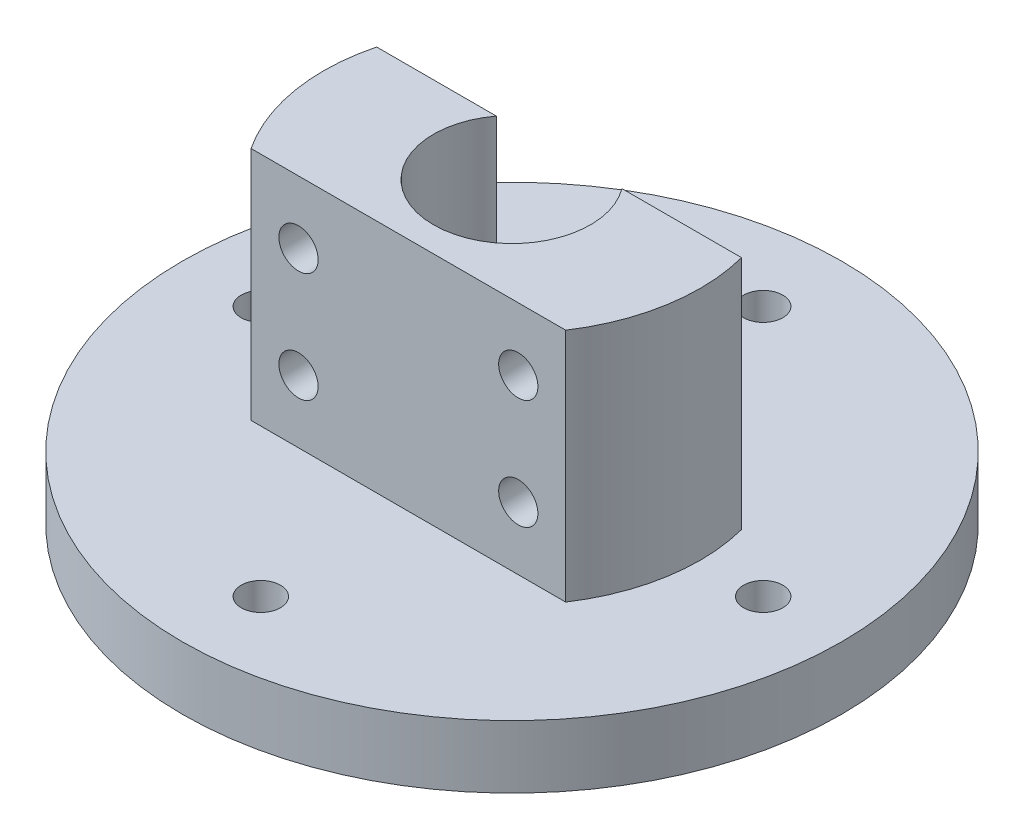
ISO-10303-21;
HEADER;
FILE_DESCRIPTION(('STEP AP214'),'2;1');
FILE_NAME('part.step','',(''),(''),'','','');
FILE_SCHEMA(('AUTOMOTIVE_DESIGN { 1 0 10303 214 1 1 1 1 }'));
ENDSEC;
DATA;
#1=APPLICATION_CONTEXT('core data for automotive mechanical design processes');
#2=APPLICATION_PROTOCOL_DEFINITION('international standard','automotive_design',2000,#1);
#3=PRODUCT_CONTEXT('',#1,'mechanical');
#4=PRODUCT('Part','Part','',(#3));
#5=PRODUCT_RELATED_PRODUCT_CATEGORY('part','',(#4));
#6=PRODUCT_DEFINITION_FORMATION('','',#4);
#7=PRODUCT_DEFINITION_CONTEXT('part definition',#1,'design');
#8=PRODUCT_DEFINITION('design','',#6,#7);
#9=PRODUCT_DEFINITION_SHAPE('','',#8);
#10=(LENGTH_UNIT() NAMED_UNIT(*) SI_UNIT(.MILLI.,.METRE.));
#11=(NAMED_UNIT(*) PLANE_ANGLE_UNIT() SI_UNIT($,.RADIAN.));
#12=(NAMED_UNIT(*) SI_UNIT($,.STERADIAN.) SOLID_ANGLE_UNIT());
#13=UNCERTAINTY_MEASURE_WITH_UNIT(LENGTH_MEASURE(1.E-05),#10,'distance_accuracy_value','');
#14=(GEOMETRIC_REPRESENTATION_CONTEXT(3) GLOBAL_UNCERTAINTY_ASSIGNED_CONTEXT((#13)) GLOBAL_UNIT_ASSIGNED_CONTEXT((#10,
#11,#12)) REPRESENTATION_CONTEXT('',''));
#15=CARTESIAN_POINT('',(0.,0.,0.));
#16=DIRECTION('',(0.,0.,1.));
#17=DIRECTION('',(1.,0.,0.));
#18=AXIS2_PLACEMENT_3D('',#15,#16,#17);
#19=CARTESIAN_POINT('',(-11.6189500386223,19.,-3.));
#20=DIRECTION('',(0.,0.,1.));
#21=DIRECTION('',(1.,0.,0.));
#22=AXIS2_PLACEMENT_3D('',#19,#20,#21);
#23=PLANE('',#22);
#24=CARTESIAN_POINT('',(-7.,15.,-3.));
#25=DIRECTION('',(0.,0.,-1.));
#26=DIRECTION('',(-1.,0.,0.));
#27=AXIS2_PLACEMENT_3D('',#24,#25,#26);
#28=CIRCLE('',#27,1.24999999999999);
#29=CARTESIAN_POINT('',(-8.24999999999998,15.,-3.));
#30=VERTEX_POINT('',#29);
#31=EDGE_CURVE('E212',#30,#30,#28,.T.);
#32=ORIENTED_EDGE('',*,*,#31,.F.);
#33=EDGE_LOOP('',(#32));
#34=FACE_BOUND('',#33,.T.);
#35=DIRECTION('',(-1.,0.,0.));
#36=VECTOR('',#35,1.);
#37=CARTESIAN_POINT('',(-11.6189500386223,19.,-3.));
#38=LINE('',#37,#36);
#39=CARTESIAN_POINT('',(-4.,19.,-3.));
#40=VERTEX_POINT('',#39);
#41=CARTESIAN_POINT('',(-11.6189500386223,19.,-3.));
#42=VERTEX_POINT('',#41);
#43=EDGE_CURVE('E121',#40,#42,#38,.T.);
#44=ORIENTED_EDGE('',*,*,#43,.F.);
#45=DIRECTION('',(0.,1.,0.));
#46=VECTOR('',#45,1.);
#47=CARTESIAN_POINT('',(-4.,0.,-3.));
#48=LINE('',#47,#46);
#49=CARTESIAN_POINT('',(-4.,4.,-3.));
#50=VERTEX_POINT('',#49);
#51=EDGE_CURVE('E64',#40,#50,#48,.F.);
#52=ORIENTED_EDGE('',*,*,#51,.T.);
#53=DIRECTION('',(-1.,0.,0.));
#54=VECTOR('',#53,1.);
#55=CARTESIAN_POINT('',(-11.6189500386223,4.,-3.));
#56=LINE('',#55,#54);
#57=CARTESIAN_POINT('',(-11.6189500386223,4.,-3.));
#58=VERTEX_POINT('',#57);
#59=EDGE_CURVE('E139',#50,#58,#56,.T.);
#60=ORIENTED_EDGE('',*,*,#59,.T.);
#61=DIRECTION('',(0.,-1.,0.));
#62=VECTOR('',#61,1.);
#63=CARTESIAN_POINT('',(-11.6189500386223,19.,-3.));
#64=LINE('',#63,#62);
#65=EDGE_CURVE('E120',#42,#58,#64,.T.);
#66=ORIENTED_EDGE('',*,*,#65,.F.);
#67=EDGE_LOOP('',(#44,#52,#60,#66));
#68=FACE_BOUND('',#67,.T.);
#69=CARTESIAN_POINT('',(-7.,8.,-3.));
#70=DIRECTION('',(0.,0.,-1.));
#71=DIRECTION('',(-1.,0.,0.));
#72=AXIS2_PLACEMENT_3D('',#69,#70,#71);
#73=CIRCLE('',#72,1.24999999999999);
#74=CARTESIAN_POINT('',(-8.24999999999998,8.,-3.));
#75=VERTEX_POINT('',#74);
#76=EDGE_CURVE('E194',#75,#75,#73,.T.);
#77=ORIENTED_EDGE('',*,*,#76,.F.);
#78=EDGE_LOOP('',(#77));
#79=FACE_BOUND('',#78,.T.);
#80=ADVANCED_FACE('F47',(#34,#68,#79),#23,.F.);
#81=CARTESIAN_POINT('',(7.,8.,-3.));
#82=DIRECTION('',(0.,0.,-1.));
#83=DIRECTION('',(-1.,0.,0.));
#84=AXIS2_PLACEMENT_3D('',#81,#82,#83);
#85=CIRCLE('',#84,1.24999999999999);
#86=CARTESIAN_POINT('',(5.75000000000002,8.,-3.));
#87=VERTEX_POINT('',#86);
#88=EDGE_CURVE('E199',#87,#87,#85,.T.);
#89=ORIENTED_EDGE('',*,*,#88,.F.);
#90=EDGE_LOOP('',(#89));
#91=FACE_BOUND('',#90,.T.);
#92=CARTESIAN_POINT('',(7.,15.,-3.));
#93=DIRECTION('',(0.,0.,-1.));
#94=DIRECTION('',(-1.,0.,0.));
#95=AXIS2_PLACEMENT_3D('',#92,#93,#94);
#96=CIRCLE('',#95,1.24999999999999);
#97=CARTESIAN_POINT('',(5.75000000000002,15.,-3.));
#98=VERTEX_POINT('',#97);
#99=EDGE_CURVE('E195',#98,#98,#96,.T.);
#100=ORIENTED_EDGE('',*,*,#99,.F.);
#101=EDGE_LOOP('',(#100));
#102=FACE_BOUND('',#101,.T.);
#103=CARTESIAN_POINT('',(11.6189500386223,4.,-3.));
#104=VERTEX_POINT('',#103);
#105=CARTESIAN_POINT('',(4.,4.,-3.));
#106=VERTEX_POINT('',#105);
#107=EDGE_CURVE('E111',#104,#106,#56,.T.);
#108=ORIENTED_EDGE('',*,*,#107,.T.);
#109=DIRECTION('',(0.,1.,0.));
#110=VECTOR('',#109,1.);
#111=CARTESIAN_POINT('',(4.,0.,-3.));
#112=LINE('',#111,#110);
#113=CARTESIAN_POINT('',(4.,19.,-3.));
#114=VERTEX_POINT('',#113);
#115=EDGE_CURVE('E103',#106,#114,#112,.T.);
#116=ORIENTED_EDGE('',*,*,#115,.T.);
#117=CARTESIAN_POINT('',(11.6189500386223,19.,-3.));
#118=VERTEX_POINT('',#117);
#119=EDGE_CURVE('E109',#118,#114,#38,.T.);
#120=ORIENTED_EDGE('',*,*,#119,.F.);
#121=DIRECTION('',(0.,-1.,0.));
#122=VECTOR('',#121,1.);
#123=CARTESIAN_POINT('',(11.6189500386223,19.,-3.));
#124=LINE('',#123,#122);
#125=EDGE_CURVE('E72',#118,#104,#124,.T.);
#126=ORIENTED_EDGE('',*,*,#125,.T.);
#127=EDGE_LOOP('',(#108,#116,#120,#126));
#128=FACE_BOUND('',#127,.T.);
#129=ADVANCED_FACE('F108',(#91,#102,#128),#23,.F.);
#130=CARTESIAN_POINT('',(0.,4.,0.));
#131=DIRECTION('',(0.,1.,0.));
#132=DIRECTION('',(0.,0.,1.));
#133=AXIS2_PLACEMENT_3D('',#130,#131,#132);
#134=PLANE('',#133);
#135=CARTESIAN_POINT('',(0.,4.,0.));
#136=DIRECTION('',(0.,1.,0.));
#137=DIRECTION('',(0.,0.,1.));
#138=AXIS2_PLACEMENT_3D('',#135,#136,#137);
#139=CIRCLE('',#138,5.);
#140=EDGE_CURVE('E114',#106,#50,#139,.T.);
#141=ORIENTED_EDGE('',*,*,#140,.F.);
#142=ORIENTED_EDGE('',*,*,#107,.F.);
#143=CARTESIAN_POINT('',(0.,4.,0.));
#144=DIRECTION('',(0.,1.,0.));
#145=DIRECTION('',(0.,0.,1.));
#146=AXIS2_PLACEMENT_3D('',#143,#144,#145);
#147=CIRCLE('',#146,12.);
#148=CARTESIAN_POINT('',(10.021975853094,4.,6.6));
#149=VERTEX_POINT('',#148);
#150=EDGE_CURVE('E136',#149,#104,#147,.T.);
#151=ORIENTED_EDGE('',*,*,#150,.F.);
#152=DIRECTION('',(1.,0.,0.));
#153=VECTOR('',#152,1.);
#154=CARTESIAN_POINT('',(-10.021975853094,4.,6.6));
#155=LINE('',#154,#153);
#156=CARTESIAN_POINT('',(-10.021975853094,4.,6.6));
#157=VERTEX_POINT('',#156);
#158=EDGE_CURVE('E133',#157,#149,#155,.T.);
#159=ORIENTED_EDGE('',*,*,#158,.F.);
#160=CARTESIAN_POINT('',(0.,4.,0.));
#161=DIRECTION('',(0.,1.,0.));
#162=DIRECTION('',(0.,0.,1.));
#163=AXIS2_PLACEMENT_3D('',#160,#161,#162);
#164=CIRCLE('',#163,12.);
#165=EDGE_CURVE('E113',#58,#157,#164,.T.);
#166=ORIENTED_EDGE('',*,*,#165,.F.);
#167=ORIENTED_EDGE('',*,*,#59,.F.);
#168=EDGE_LOOP('',(#141,#142,#151,#159,#166,#167));
#169=FACE_BOUND('',#168,.T.);
#170=CARTESIAN_POINT('',(0.,4.,-16.));
#171=DIRECTION('',(0.,1.,0.));
#172=DIRECTION('',(0.,0.,1.));
#173=AXIS2_PLACEMENT_3D('',#170,#171,#172);
#174=CIRCLE('',#173,1.24999999999999);
#175=CARTESIAN_POINT('',(0.,4.,-14.75));
#176=VERTEX_POINT('',#175);
#177=EDGE_CURVE('E152',#176,#176,#174,.T.);
#178=ORIENTED_EDGE('',*,*,#177,.F.);
#179=EDGE_LOOP('',(#178));
#180=FACE_BOUND('',#179,.T.);
#181=CARTESIAN_POINT('',(16.,4.,0.));
#182=DIRECTION('',(0.,1.,0.));
#183=DIRECTION('',(0.,0.,1.));
#184=AXIS2_PLACEMENT_3D('',#181,#182,#183);
#185=CIRCLE('',#184,1.24999999999999);
#186=CARTESIAN_POINT('',(16.,4.,1.25000000000004));
#187=VERTEX_POINT('',#186);
#188=EDGE_CURVE('E160',#187,#187,#185,.T.);
#189=ORIENTED_EDGE('',*,*,#188,.F.);
#190=EDGE_LOOP('',(#189));
#191=FACE_BOUND('',#190,.T.);
#192=CARTESIAN_POINT('',(-1.1172740284298E-13,4.,16.));
#193=DIRECTION('',(0.,1.,0.));
#194=DIRECTION('',(0.,0.,1.));
#195=AXIS2_PLACEMENT_3D('',#192,#193,#194);
#196=CIRCLE('',#195,1.24999999999999);
#197=CARTESIAN_POINT('',(-1.1172740284298E-13,4.,17.25));
#198=VERTEX_POINT('',#197);
#199=EDGE_CURVE('E168',#198,#198,#196,.T.);
#200=ORIENTED_EDGE('',*,*,#199,.F.);
#201=EDGE_LOOP('',(#200));
#202=FACE_BOUND('',#201,.T.);
#203=CARTESIAN_POINT('',(-16.,4.,-1.6759110426447E-13));
#204=DIRECTION('',(0.,1.,0.));
#205=DIRECTION('',(0.,0.,1.));
#206=AXIS2_PLACEMENT_3D('',#203,#204,#205);
#207=CIRCLE('',#206,1.24999999999999);
#208=CARTESIAN_POINT('',(-16.,4.,1.24999999999982));
#209=VERTEX_POINT('',#208);
#210=EDGE_CURVE('E176',#209,#209,#207,.T.);
#211=ORIENTED_EDGE('',*,*,#210,.F.);
#212=EDGE_LOOP('',(#211));
#213=FACE_BOUND('',#212,.T.);
#214=CARTESIAN_POINT('',(0.,4.,0.));
#215=DIRECTION('',(0.,1.,0.));
#216=DIRECTION('',(0.,0.,1.));
#217=AXIS2_PLACEMENT_3D('',#214,#215,#216);
#218=CIRCLE('',#217,21.);
#219=CARTESIAN_POINT('',(0.,4.,21.));
#220=VERTEX_POINT('',#219);
#221=EDGE_CURVE('E57',#220,#220,#218,.T.);
#222=ORIENTED_EDGE('',*,*,#221,.T.);
#223=EDGE_LOOP('',(#222));
#224=FACE_BOUND('',#223,.T.);
#225=ADVANCED_FACE('F245',(#169,#180,#191,#202,#213,#224),#134,.T.);
#226=CARTESIAN_POINT('',(0.,4.,0.));
#227=DIRECTION('',(0.,-1.,0.));
#228=DIRECTION('',(0.,0.,-1.));
#229=AXIS2_PLACEMENT_3D('',#226,#227,#228);
#230=CYLINDRICAL_SURFACE('',#229,21.);
#231=ORIENTED_EDGE('',*,*,#221,.F.);
#232=EDGE_LOOP('',(#231));
#233=FACE_BOUND('',#232,.T.);
#234=CARTESIAN_POINT('',(0.,0.,0.));
#235=DIRECTION('',(0.,1.,0.));
#236=DIRECTION('',(0.,0.,1.));
#237=AXIS2_PLACEMENT_3D('',#234,#235,#236);
#238=CIRCLE('',#237,21.);
#239=CARTESIAN_POINT('',(0.,0.,21.));
#240=VERTEX_POINT('',#239);
#241=EDGE_CURVE('E184',#240,#240,#238,.T.);
#242=ORIENTED_EDGE('',*,*,#241,.T.);
#243=EDGE_LOOP('',(#242));
#244=FACE_BOUND('',#243,.T.);
#245=ADVANCED_FACE('F49',(#233,#244),#230,.T.);
#246=CARTESIAN_POINT('',(0.,0.,0.));
#247=DIRECTION('',(0.,1.,0.));
#248=DIRECTION('',(0.,0.,1.));
#249=AXIS2_PLACEMENT_3D('',#246,#247,#248);
#250=PLANE('',#249);
#251=CARTESIAN_POINT('',(0.,0.,0.));
#252=DIRECTION('',(0.,1.,0.));
#253=DIRECTION('',(0.,0.,1.));
#254=AXIS2_PLACEMENT_3D('',#251,#252,#253);
#255=CIRCLE('',#254,5.);
#256=CARTESIAN_POINT('',(0.,0.,5.));
#257=VERTEX_POINT('',#256);
#258=EDGE_CURVE('E222',#257,#257,#255,.T.);
#259=ORIENTED_EDGE('',*,*,#258,.T.);
#260=EDGE_LOOP('',(#259));
#261=FACE_BOUND('',#260,.T.);
#262=CARTESIAN_POINT('',(0.,0.,-16.));
#263=DIRECTION('',(0.,1.,0.));
#264=DIRECTION('',(0.,0.,1.));
#265=AXIS2_PLACEMENT_3D('',#262,#263,#264);
#266=CIRCLE('',#265,1.25);
#267=CARTESIAN_POINT('',(0.,0.,-14.75));
#268=VERTEX_POINT('',#267);
#269=EDGE_CURVE('E156',#268,#268,#266,.T.);
#270=ORIENTED_EDGE('',*,*,#269,.T.);
#271=EDGE_LOOP('',(#270));
#272=FACE_BOUND('',#271,.T.);
#273=CARTESIAN_POINT('',(16.,0.,0.));
#274=DIRECTION('',(0.,1.,0.));
#275=DIRECTION('',(0.,0.,1.));
#276=AXIS2_PLACEMENT_3D('',#273,#274,#275);
#277=CIRCLE('',#276,1.25);
#278=CARTESIAN_POINT('',(16.,0.,1.25000000000005));
#279=VERTEX_POINT('',#278);
#280=EDGE_CURVE('E164',#279,#279,#277,.T.);
#281=ORIENTED_EDGE('',*,*,#280,.T.);
#282=EDGE_LOOP('',(#281));
#283=FACE_BOUND('',#282,.T.);
#284=CARTESIAN_POINT('',(-1.1172740284298E-13,0.,16.));
#285=DIRECTION('',(0.,1.,0.));
#286=DIRECTION('',(0.,0.,1.));
#287=AXIS2_PLACEMENT_3D('',#284,#285,#286);
#288=CIRCLE('',#287,1.25);
#289=CARTESIAN_POINT('',(-1.1172740284298E-13,0.,17.25));
#290=VERTEX_POINT('',#289);
#291=EDGE_CURVE('E172',#290,#290,#288,.T.);
#292=ORIENTED_EDGE('',*,*,#291,.T.);
#293=EDGE_LOOP('',(#292));
#294=FACE_BOUND('',#293,.T.);
#295=CARTESIAN_POINT('',(-16.,0.,-1.6759110426447E-13));
#296=DIRECTION('',(0.,1.,0.));
#297=DIRECTION('',(0.,0.,1.));
#298=AXIS2_PLACEMENT_3D('',#295,#296,#297);
#299=CIRCLE('',#298,1.25);
#300=CARTESIAN_POINT('',(-16.,0.,1.24999999999983));
#301=VERTEX_POINT('',#300);
#302=EDGE_CURVE('E180',#301,#301,#299,.T.);
#303=ORIENTED_EDGE('',*,*,#302,.T.);
#304=EDGE_LOOP('',(#303));
#305=FACE_BOUND('',#304,.T.);
#306=ORIENTED_EDGE('',*,*,#241,.F.);
#307=EDGE_LOOP('',(#306));
#308=FACE_BOUND('',#307,.T.);
#309=ADVANCED_FACE('F354',(#261,#272,#283,#294,#305,#308),#250,.F.);
#310=CARTESIAN_POINT('',(-16.,4.,-1.6759110426447E-13));
#311=DIRECTION('',(0.,1.,0.));
#312=DIRECTION('',(0.,0.,1.));
#313=AXIS2_PLACEMENT_3D('',#310,#311,#312);
#314=CYLINDRICAL_SURFACE('',#313,1.24999999999999);
#315=ORIENTED_EDGE('',*,*,#302,.F.);
#316=EDGE_LOOP('',(#315));
#317=FACE_BOUND('',#316,.T.);
#318=ORIENTED_EDGE('',*,*,#210,.T.);
#319=EDGE_LOOP('',(#318));
#320=FACE_BOUND('',#319,.T.);
#321=ADVANCED_FACE('F347',(#317,#320),#314,.F.);
#322=CARTESIAN_POINT('',(-1.1172740284298E-13,4.,16.));
#323=DIRECTION('',(0.,1.,0.));
#324=DIRECTION('',(0.,0.,1.));
#325=AXIS2_PLACEMENT_3D('',#322,#323,#324);
#326=CYLINDRICAL_SURFACE('',#325,1.24999999999999);
#327=ORIENTED_EDGE('',*,*,#291,.F.);
#328=EDGE_LOOP('',(#327));
#329=FACE_BOUND('',#328,.T.);
#330=ORIENTED_EDGE('',*,*,#199,.T.);
#331=EDGE_LOOP('',(#330));
#332=FACE_BOUND('',#331,.T.);
#333=ADVANCED_FACE('F339',(#329,#332),#326,.F.);
#334=CARTESIAN_POINT('',(16.,4.,0.));
#335=DIRECTION('',(0.,1.,0.));
#336=DIRECTION('',(0.,0.,1.));
#337=AXIS2_PLACEMENT_3D('',#334,#335,#336);
#338=CYLINDRICAL_SURFACE('',#337,1.24999999999999);
#339=ORIENTED_EDGE('',*,*,#280,.F.);
#340=EDGE_LOOP('',(#339));
#341=FACE_BOUND('',#340,.T.);
#342=ORIENTED_EDGE('',*,*,#188,.T.);
#343=EDGE_LOOP('',(#342));
#344=FACE_BOUND('',#343,.T.);
#345=ADVANCED_FACE('F265',(#341,#344),#338,.F.);
#346=CARTESIAN_POINT('',(0.,4.,-16.));
#347=DIRECTION('',(0.,1.,0.));
#348=DIRECTION('',(0.,0.,1.));
#349=AXIS2_PLACEMENT_3D('',#346,#347,#348);
#350=CYLINDRICAL_SURFACE('',#349,1.24999999999999);
#351=ORIENTED_EDGE('',*,*,#269,.F.);
#352=EDGE_LOOP('',(#351));
#353=FACE_BOUND('',#352,.T.);
#354=ORIENTED_EDGE('',*,*,#177,.T.);
#355=EDGE_LOOP('',(#354));
#356=FACE_BOUND('',#355,.T.);
#357=ADVANCED_FACE('F255',(#353,#356),#350,.F.);
#358=CARTESIAN_POINT('',(0.,19.,0.));
#359=DIRECTION('',(0.,-1.,0.));
#360=DIRECTION('',(0.,0.,-1.));
#361=AXIS2_PLACEMENT_3D('',#358,#359,#360);
#362=CYLINDRICAL_SURFACE('',#361,12.);
#363=ORIENTED_EDGE('',*,*,#165,.T.);
#364=DIRECTION('',(0.,-1.,0.));
#365=VECTOR('',#364,1.);
#366=CARTESIAN_POINT('',(-10.021975853094,19.,6.6));
#367=LINE('',#366,#365);
#368=CARTESIAN_POINT('',(-10.021975853094,19.,6.6));
#369=VERTEX_POINT('',#368);
#370=EDGE_CURVE('E149',#369,#157,#367,.T.);
#371=ORIENTED_EDGE('',*,*,#370,.F.);
#372=CARTESIAN_POINT('',(0.,19.,0.));
#373=DIRECTION('',(0.,1.,0.));
#374=DIRECTION('',(0.,0.,1.));
#375=AXIS2_PLACEMENT_3D('',#372,#373,#374);
#376=CIRCLE('',#375,12.);
#377=EDGE_CURVE('E141',#42,#369,#376,.T.);
#378=ORIENTED_EDGE('',*,*,#377,.F.);
#379=ORIENTED_EDGE('',*,*,#65,.T.);
#380=EDGE_LOOP('',(#363,#371,#378,#379));
#381=FACE_BOUND('',#380,.T.);
#382=ADVANCED_FACE('F253',(#381),#362,.T.);
#383=CARTESIAN_POINT('',(-10.021975853094,19.,6.6));
#384=DIRECTION('',(0.,0.,-1.));
#385=DIRECTION('',(-1.,0.,0.));
#386=AXIS2_PLACEMENT_3D('',#383,#384,#385);
#387=PLANE('',#386);
#388=CARTESIAN_POINT('',(-7.,15.,6.6));
#389=DIRECTION('',(0.,0.,-1.));
#390=DIRECTION('',(-1.,0.,0.));
#391=AXIS2_PLACEMENT_3D('',#388,#389,#390);
#392=CIRCLE('',#391,1.24999999999999);
#393=CARTESIAN_POINT('',(-8.24999999999999,15.,6.6));
#394=VERTEX_POINT('',#393);
#395=EDGE_CURVE('E51',#394,#394,#392,.T.);
#396=ORIENTED_EDGE('',*,*,#395,.T.);
#397=EDGE_LOOP('',(#396));
#398=FACE_BOUND('',#397,.T.);
#399=CARTESIAN_POINT('',(7.,8.,6.6));
#400=DIRECTION('',(0.,0.,-1.));
#401=DIRECTION('',(-1.,0.,0.));
#402=AXIS2_PLACEMENT_3D('',#399,#400,#401);
#403=CIRCLE('',#402,1.24999999999999);
#404=CARTESIAN_POINT('',(5.75000000000001,8.,6.6));
#405=VERTEX_POINT('',#404);
#406=EDGE_CURVE('E196',#405,#405,#403,.T.);
#407=ORIENTED_EDGE('',*,*,#406,.T.);
#408=EDGE_LOOP('',(#407));
#409=FACE_BOUND('',#408,.T.);
#410=CARTESIAN_POINT('',(7.,15.,6.6));
#411=DIRECTION('',(0.,0.,-1.));
#412=DIRECTION('',(-1.,0.,0.));
#413=AXIS2_PLACEMENT_3D('',#410,#411,#412);
#414=CIRCLE('',#413,1.24999999999999);
#415=CARTESIAN_POINT('',(5.75000000000001,15.,6.6));
#416=VERTEX_POINT('',#415);
#417=EDGE_CURVE('E191',#416,#416,#414,.T.);
#418=ORIENTED_EDGE('',*,*,#417,.T.);
#419=EDGE_LOOP('',(#418));
#420=FACE_BOUND('',#419,.T.);
#421=CARTESIAN_POINT('',(-7.,8.,6.6));
#422=DIRECTION('',(0.,0.,-1.));
#423=DIRECTION('',(-1.,0.,0.));
#424=AXIS2_PLACEMENT_3D('',#421,#422,#423);
#425=CIRCLE('',#424,1.24999999999999);
#426=CARTESIAN_POINT('',(-8.24999999999999,8.,6.6));
#427=VERTEX_POINT('',#426);
#428=EDGE_CURVE('E218',#427,#427,#425,.T.);
#429=ORIENTED_EDGE('',*,*,#428,.T.);
#430=EDGE_LOOP('',(#429));
#431=FACE_BOUND('',#430,.T.);
#432=ORIENTED_EDGE('',*,*,#158,.T.);
#433=DIRECTION('',(0.,-1.,0.));
#434=VECTOR('',#433,1.);
#435=CARTESIAN_POINT('',(10.021975853094,19.,6.6));
#436=LINE('',#435,#434);
#437=CARTESIAN_POINT('',(10.021975853094,19.,6.6));
#438=VERTEX_POINT('',#437);
#439=EDGE_CURVE('E145',#438,#149,#436,.T.);
#440=ORIENTED_EDGE('',*,*,#439,.F.);
#441=DIRECTION('',(1.,0.,0.));
#442=VECTOR('',#441,1.);
#443=CARTESIAN_POINT('',(-10.021975853094,19.,6.6));
#444=LINE('',#443,#442);
#445=EDGE_CURVE('E232',#369,#438,#444,.T.);
#446=ORIENTED_EDGE('',*,*,#445,.F.);
#447=ORIENTED_EDGE('',*,*,#370,.T.);
#448=EDGE_LOOP('',(#432,#440,#446,#447));
#449=FACE_BOUND('',#448,.T.);
#450=ADVANCED_FACE('F239',(#398,#409,#420,#431,#449),#387,.F.);
#451=CARTESIAN_POINT('',(0.,19.,0.));
#452=DIRECTION('',(0.,-1.,0.));
#453=DIRECTION('',(0.,0.,-1.));
#454=AXIS2_PLACEMENT_3D('',#451,#452,#453);
#455=CYLINDRICAL_SURFACE('',#454,12.);
#456=ORIENTED_EDGE('',*,*,#150,.T.);
#457=ORIENTED_EDGE('',*,*,#125,.F.);
#458=CARTESIAN_POINT('',(0.,19.,0.));
#459=DIRECTION('',(0.,1.,0.));
#460=DIRECTION('',(0.,0.,1.));
#461=AXIS2_PLACEMENT_3D('',#458,#459,#460);
#462=CIRCLE('',#461,12.);
#463=EDGE_CURVE('E118',#438,#118,#462,.T.);
#464=ORIENTED_EDGE('',*,*,#463,.F.);
#465=ORIENTED_EDGE('',*,*,#439,.T.);
#466=EDGE_LOOP('',(#456,#457,#464,#465));
#467=FACE_BOUND('',#466,.T.);
#468=ADVANCED_FACE('F243',(#467),#455,.T.);
#469=CARTESIAN_POINT('',(0.,19.,0.));
#470=DIRECTION('',(0.,1.,0.));
#471=DIRECTION('',(0.,0.,1.));
#472=AXIS2_PLACEMENT_3D('',#469,#470,#471);
#473=PLANE('',#472);
#474=CARTESIAN_POINT('',(0.,19.,0.));
#475=DIRECTION('',(0.,1.,0.));
#476=DIRECTION('',(0.,0.,1.));
#477=AXIS2_PLACEMENT_3D('',#474,#475,#476);
#478=CIRCLE('',#477,5.);
#479=EDGE_CURVE('E11',#40,#114,#478,.T.);
#480=ORIENTED_EDGE('',*,*,#479,.F.);
#481=ORIENTED_EDGE('',*,*,#43,.T.);
#482=ORIENTED_EDGE('',*,*,#377,.T.);
#483=ORIENTED_EDGE('',*,*,#445,.T.);
#484=ORIENTED_EDGE('',*,*,#463,.T.);
#485=ORIENTED_EDGE('',*,*,#119,.T.);
#486=EDGE_LOOP('',(#480,#481,#482,#483,#484,#485));
#487=FACE_BOUND('',#486,.T.);
#488=ADVANCED_FACE('F116',(#487),#473,.T.);
#489=CARTESIAN_POINT('',(0.,0.,0.));
#490=DIRECTION('',(0.,1.,0.));
#491=DIRECTION('',(0.,0.,1.));
#492=AXIS2_PLACEMENT_3D('',#489,#490,#491);
#493=CYLINDRICAL_SURFACE('',#492,5.);
#494=ORIENTED_EDGE('',*,*,#258,.F.);
#495=EDGE_LOOP('',(#494));
#496=FACE_BOUND('',#495,.T.);
#497=ORIENTED_EDGE('',*,*,#140,.T.);
#498=ORIENTED_EDGE('',*,*,#51,.F.);
#499=ORIENTED_EDGE('',*,*,#479,.T.);
#500=ORIENTED_EDGE('',*,*,#115,.F.);
#501=EDGE_LOOP('',(#497,#498,#499,#500));
#502=FACE_BOUND('',#501,.T.);
#503=ADVANCED_FACE('F102',(#496,#502),#493,.F.);
#504=CARTESIAN_POINT('',(-7.,8.,-3.));
#505=DIRECTION('',(0.,0.,-1.));
#506=DIRECTION('',(-1.,0.,0.));
#507=AXIS2_PLACEMENT_3D('',#504,#505,#506);
#508=CYLINDRICAL_SURFACE('',#507,1.24999999999999);
#509=ORIENTED_EDGE('',*,*,#76,.T.);
#510=EDGE_LOOP('',(#509));
#511=FACE_BOUND('',#510,.T.);
#512=ORIENTED_EDGE('',*,*,#428,.F.);
#513=EDGE_LOOP('',(#512));
#514=FACE_BOUND('',#513,.T.);
#515=ADVANCED_FACE('F287',(#511,#514),#508,.F.);
#516=CARTESIAN_POINT('',(7.,15.,-3.));
#517=DIRECTION('',(0.,0.,-1.));
#518=DIRECTION('',(-1.,0.,0.));
#519=AXIS2_PLACEMENT_3D('',#516,#517,#518);
#520=CYLINDRICAL_SURFACE('',#519,1.24999999999999);
#521=ORIENTED_EDGE('',*,*,#99,.T.);
#522=EDGE_LOOP('',(#521));
#523=FACE_BOUND('',#522,.T.);
#524=ORIENTED_EDGE('',*,*,#417,.F.);
#525=EDGE_LOOP('',(#524));
#526=FACE_BOUND('',#525,.T.);
#527=ADVANCED_FACE('F292',(#523,#526),#520,.F.);
#528=CARTESIAN_POINT('',(7.,8.,-3.));
#529=DIRECTION('',(0.,0.,-1.));
#530=DIRECTION('',(-1.,0.,0.));
#531=AXIS2_PLACEMENT_3D('',#528,#529,#530);
#532=CYLINDRICAL_SURFACE('',#531,1.24999999999999);
#533=ORIENTED_EDGE('',*,*,#88,.T.);
#534=EDGE_LOOP('',(#533));
#535=FACE_BOUND('',#534,.T.);
#536=ORIENTED_EDGE('',*,*,#406,.F.);
#537=EDGE_LOOP('',(#536));
#538=FACE_BOUND('',#537,.T.);
#539=ADVANCED_FACE('F299',(#535,#538),#532,.F.);
#540=CARTESIAN_POINT('',(-7.,15.,-3.));
#541=DIRECTION('',(0.,0.,-1.));
#542=DIRECTION('',(-1.,0.,0.));
#543=AXIS2_PLACEMENT_3D('',#540,#541,#542);
#544=CYLINDRICAL_SURFACE('',#543,1.24999999999999);
#545=ORIENTED_EDGE('',*,*,#31,.T.);
#546=EDGE_LOOP('',(#545));
#547=FACE_BOUND('',#546,.T.);
#548=ORIENTED_EDGE('',*,*,#395,.F.);
#549=EDGE_LOOP('',(#548));
#550=FACE_BOUND('',#549,.T.);
#551=ADVANCED_FACE('F303',(#547,#550),#544,.F.);
#552=CLOSED_SHELL('',(#80,#129,#225,#245,#309,#321,#333,#345,#357,#382,#450,#468,#488,#503,#515,
#527,#539,#551));
#553=MANIFOLD_SOLID_BREP('B2',#552);
#554=ADVANCED_BREP_SHAPE_REPRESENTATION('',(#18,#553),#14);
#555=SHAPE_DEFINITION_REPRESENTATION(#9,#554);
ENDSEC;
END-ISO-10303-21;
